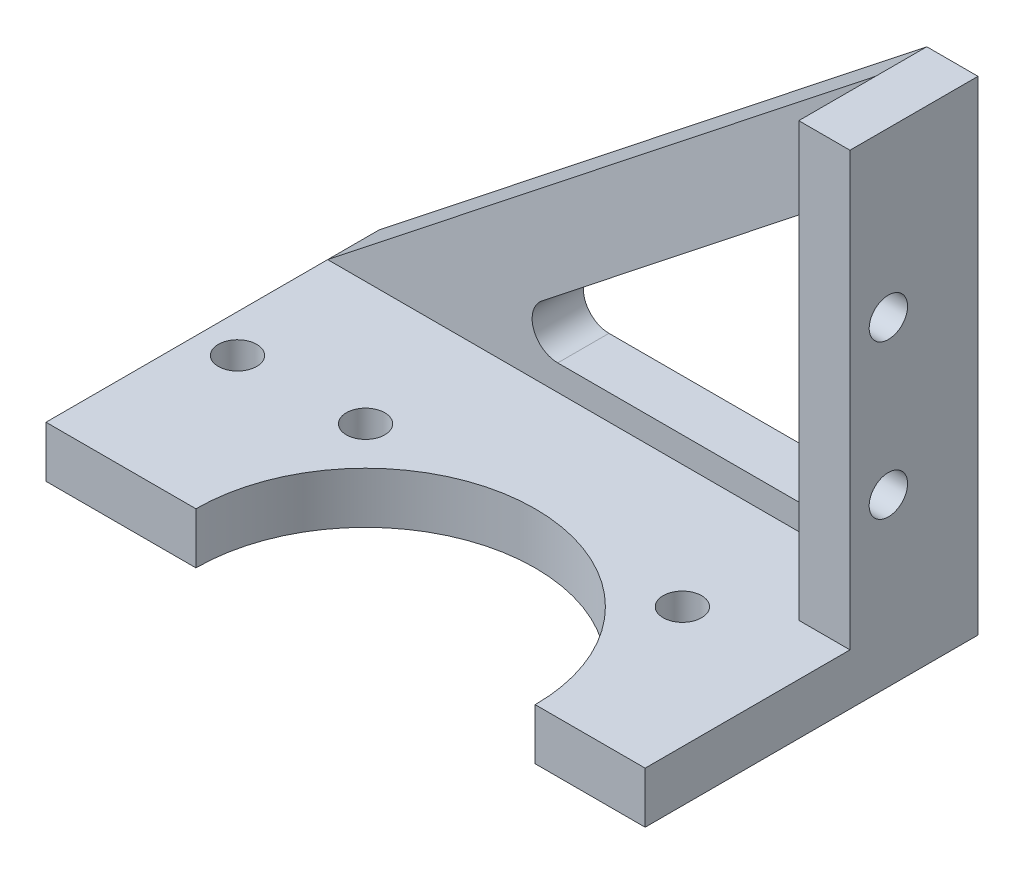
ISO-10303-21;
HEADER;
FILE_DESCRIPTION(('STEP AP214'),'2;1');
FILE_NAME('part.step','',(''),(''),'','','');
FILE_SCHEMA(('AUTOMOTIVE_DESIGN { 1 0 10303 214 1 1 1 1 }'));
ENDSEC;
DATA;
#1=APPLICATION_CONTEXT('core data for automotive mechanical design processes');
#2=APPLICATION_PROTOCOL_DEFINITION('international standard','automotive_design',2000,#1);
#3=PRODUCT_CONTEXT('',#1,'mechanical');
#4=PRODUCT('Part','Part','',(#3));
#5=PRODUCT_RELATED_PRODUCT_CATEGORY('part','',(#4));
#6=PRODUCT_DEFINITION_FORMATION('','',#4);
#7=PRODUCT_DEFINITION_CONTEXT('part definition',#1,'design');
#8=PRODUCT_DEFINITION('design','',#6,#7);
#9=PRODUCT_DEFINITION_SHAPE('','',#8);
#10=(LENGTH_UNIT() NAMED_UNIT(*) SI_UNIT(.MILLI.,.METRE.));
#11=(NAMED_UNIT(*) PLANE_ANGLE_UNIT() SI_UNIT($,.RADIAN.));
#12=(NAMED_UNIT(*) SI_UNIT($,.STERADIAN.) SOLID_ANGLE_UNIT());
#13=UNCERTAINTY_MEASURE_WITH_UNIT(LENGTH_MEASURE(1.E-05),#10,'distance_accuracy_value','');
#14=(GEOMETRIC_REPRESENTATION_CONTEXT(3) GLOBAL_UNCERTAINTY_ASSIGNED_CONTEXT((#13)) GLOBAL_UNIT_ASSIGNED_CONTEXT((#10,
#11,#12)) REPRESENTATION_CONTEXT('',''));
#15=CARTESIAN_POINT('',(0.,0.,0.));
#16=DIRECTION('',(0.,0.,1.));
#17=DIRECTION('',(1.,0.,0.));
#18=AXIS2_PLACEMENT_3D('',#15,#16,#17);
#19=CARTESIAN_POINT('',(0.,0.,0.));
#20=DIRECTION('',(0.,0.,1.));
#21=DIRECTION('',(-1.,0.,0.));
#22=AXIS2_PLACEMENT_3D('',#19,#20,#21);
#23=PLANE('',#22);
#24=DIRECTION('',(0.,1.,0.));
#25=VECTOR('',#24,1.);
#26=CARTESIAN_POINT('',(-11.69,-2.,0.));
#27=LINE('',#26,#25);
#28=CARTESIAN_POINT('',(-11.69,-2.,0.));
#29=VERTEX_POINT('',#28);
#30=CARTESIAN_POINT('',(-11.69,2.,0.));
#31=VERTEX_POINT('',#30);
#32=EDGE_CURVE('E203',#29,#31,#27,.T.);
#33=ORIENTED_EDGE('',*,*,#32,.T.);
#34=DIRECTION('',(-1.,0.,0.));
#35=VECTOR('',#34,1.);
#36=CARTESIAN_POINT('',(-16.4,2.,0.));
#37=LINE('',#36,#35);
#38=CARTESIAN_POINT('',(-23.4,2.,0.));
#39=VERTEX_POINT('',#38);
#40=EDGE_CURVE('E311',#31,#39,#37,.T.);
#41=ORIENTED_EDGE('',*,*,#40,.T.);
#42=DIRECTION('',(0.,-1.,0.));
#43=VECTOR('',#42,1.);
#44=CARTESIAN_POINT('',(-23.4,-2.,0.));
#45=LINE('',#44,#43);
#46=CARTESIAN_POINT('',(-23.4,-2.,0.));
#47=VERTEX_POINT('',#46);
#48=EDGE_CURVE('E295',#39,#47,#45,.T.);
#49=ORIENTED_EDGE('',*,*,#48,.T.);
#50=DIRECTION('',(1.,0.,0.));
#51=VECTOR('',#50,1.);
#52=CARTESIAN_POINT('',(23.4,-2.,0.));
#53=LINE('',#52,#51);
#54=EDGE_CURVE('E308',#47,#29,#53,.T.);
#55=ORIENTED_EDGE('',*,*,#54,.T.);
#56=EDGE_LOOP('',(#33,#41,#49,#55));
#57=FACE_BOUND('',#56,.T.);
#58=ADVANCED_FACE('F37',(#57),#23,.T.);
#59=CARTESIAN_POINT('',(19.4,35.8,-26.));
#60=DIRECTION('',(1.,0.,0.));
#61=DIRECTION('',(0.,1.,0.));
#62=AXIS2_PLACEMENT_3D('',#59,#60,#61);
#63=PLANE('',#62);
#64=CARTESIAN_POINT('',(19.4,23.,-19.));
#65=DIRECTION('',(1.,0.,0.));
#66=DIRECTION('',(0.,-1.,0.));
#67=AXIS2_PLACEMENT_3D('',#64,#65,#66);
#68=CIRCLE('',#67,1.5);
#69=CARTESIAN_POINT('',(19.4,21.5,-19.));
#70=VERTEX_POINT('',#69);
#71=EDGE_CURVE('E210',#70,#70,#68,.T.);
#72=ORIENTED_EDGE('',*,*,#71,.T.);
#73=EDGE_LOOP('',(#72));
#74=FACE_BOUND('',#73,.T.);
#75=CARTESIAN_POINT('',(19.4,11.,-19.));
#76=DIRECTION('',(1.,0.,0.));
#77=DIRECTION('',(0.,-1.,0.));
#78=AXIS2_PLACEMENT_3D('',#75,#76,#77);
#79=CIRCLE('',#78,1.5);
#80=CARTESIAN_POINT('',(19.4,9.50000000000001,-19.));
#81=VERTEX_POINT('',#80);
#82=EDGE_CURVE('E250',#81,#81,#79,.T.);
#83=ORIENTED_EDGE('',*,*,#82,.T.);
#84=EDGE_LOOP('',(#83));
#85=FACE_BOUND('',#84,.T.);
#86=DIRECTION('',(0.,0.,1.));
#87=VECTOR('',#86,1.);
#88=CARTESIAN_POINT('',(19.4,35.8,-26.));
#89=LINE('',#88,#87);
#90=CARTESIAN_POINT('',(19.4,35.8,-22.));
#91=VERTEX_POINT('',#90);
#92=CARTESIAN_POINT('',(19.4,35.8,-16.));
#93=VERTEX_POINT('',#92);
#94=EDGE_CURVE('E176',#91,#93,#89,.T.);
#95=ORIENTED_EDGE('',*,*,#94,.F.);
#96=DIRECTION('',(0.,1.,0.));
#97=VECTOR('',#96,1.);
#98=CARTESIAN_POINT('',(19.4,35.8,-22.));
#99=LINE('',#98,#97);
#100=CARTESIAN_POINT('',(19.4,2.,-22.));
#101=VERTEX_POINT('',#100);
#102=EDGE_CURVE('E175',#101,#91,#99,.T.);
#103=ORIENTED_EDGE('',*,*,#102,.F.);
#104=DIRECTION('',(0.,0.,1.));
#105=VECTOR('',#104,1.);
#106=CARTESIAN_POINT('',(19.4,2.,-26.));
#107=LINE('',#106,#105);
#108=CARTESIAN_POINT('',(19.4,2.,-16.));
#109=VERTEX_POINT('',#108);
#110=EDGE_CURVE('E157',#101,#109,#107,.T.);
#111=ORIENTED_EDGE('',*,*,#110,.T.);
#112=DIRECTION('',(0.,1.,0.));
#113=VECTOR('',#112,1.);
#114=CARTESIAN_POINT('',(19.4,35.8,-16.));
#115=LINE('',#114,#113);
#116=EDGE_CURVE('E164',#109,#93,#115,.T.);
#117=ORIENTED_EDGE('',*,*,#116,.T.);
#118=EDGE_LOOP('',(#95,#103,#111,#117));
#119=FACE_BOUND('',#118,.T.);
#120=ADVANCED_FACE('F173',(#74,#85,#119),#63,.F.);
#121=CARTESIAN_POINT('',(-16.4,2.,-26.));
#122=DIRECTION('',(0.,-1.,0.));
#123=DIRECTION('',(0.,0.,1.));
#124=AXIS2_PLACEMENT_3D('',#121,#122,#123);
#125=PLANE('',#124);
#126=CARTESIAN_POINT('',(-20.44,2.,-12.));
#127=DIRECTION('',(0.,-1.,0.));
#128=DIRECTION('',(-1.,0.,0.));
#129=AXIS2_PLACEMENT_3D('',#126,#127,#128);
#130=CIRCLE('',#129,1.5);
#131=CARTESIAN_POINT('',(-21.94,2.,-12.));
#132=VERTEX_POINT('',#131);
#133=EDGE_CURVE('E270',#132,#132,#130,.T.);
#134=ORIENTED_EDGE('',*,*,#133,.T.);
#135=EDGE_LOOP('',(#134));
#136=FACE_BOUND('',#135,.T.);
#137=CARTESIAN_POINT('',(13.9343686707647,2.,-12.3743686707644));
#138=DIRECTION('',(0.,-1.,0.));
#139=DIRECTION('',(-1.,0.,0.));
#140=AXIS2_PLACEMENT_3D('',#137,#138,#139);
#141=CIRCLE('',#140,1.5);
#142=CARTESIAN_POINT('',(12.4343686707647,2.,-12.3743686707644));
#143=VERTEX_POINT('',#142);
#144=EDGE_CURVE('E283',#143,#143,#141,.T.);
#145=ORIENTED_EDGE('',*,*,#144,.T.);
#146=EDGE_LOOP('',(#145));
#147=FACE_BOUND('',#146,.T.);
#148=CARTESIAN_POINT('',(-10.8143686707644,2.,-12.3743686707647));
#149=DIRECTION('',(0.,-1.,0.));
#150=DIRECTION('',(-1.,0.,0.));
#151=AXIS2_PLACEMENT_3D('',#148,#149,#150);
#152=CIRCLE('',#151,1.5);
#153=CARTESIAN_POINT('',(-12.3143686707644,2.,-12.3743686707647));
#154=VERTEX_POINT('',#153);
#155=EDGE_CURVE('E265',#154,#154,#152,.T.);
#156=ORIENTED_EDGE('',*,*,#155,.T.);
#157=EDGE_LOOP('',(#156));
#158=FACE_BOUND('',#157,.T.);
#159=CARTESIAN_POINT('',(23.4,2.00000000000001,0.));
#160=VERTEX_POINT('',#159);
#161=CARTESIAN_POINT('',(14.81,2.,0.));
#162=VERTEX_POINT('',#161);
#163=EDGE_CURVE('E185',#160,#162,#37,.T.);
#164=ORIENTED_EDGE('',*,*,#163,.F.);
#165=DIRECTION('',(0.,0.,-1.));
#166=VECTOR('',#165,1.);
#167=CARTESIAN_POINT('',(23.4,2.00000000000001,-26.));
#168=LINE('',#167,#166);
#169=CARTESIAN_POINT('',(23.4,2.,-16.));
#170=VERTEX_POINT('',#169);
#171=EDGE_CURVE('E160',#160,#170,#168,.T.);
#172=ORIENTED_EDGE('',*,*,#171,.T.);
#173=DIRECTION('',(-1.,0.,0.));
#174=VECTOR('',#173,1.);
#175=CARTESIAN_POINT('',(29.4,2.00000000000001,-16.));
#176=LINE('',#175,#174);
#177=EDGE_CURVE('E151',#170,#109,#176,.T.);
#178=ORIENTED_EDGE('',*,*,#177,.T.);
#179=ORIENTED_EDGE('',*,*,#110,.F.);
#180=DIRECTION('',(1.,0.,0.));
#181=VECTOR('',#180,1.);
#182=CARTESIAN_POINT('',(19.4,2.,-22.));
#183=LINE('',#182,#181);
#184=CARTESIAN_POINT('',(-23.4,2.,-22.));
#185=VERTEX_POINT('',#184);
#186=EDGE_CURVE('E290',#185,#101,#183,.T.);
#187=ORIENTED_EDGE('',*,*,#186,.F.);
#188=DIRECTION('',(0.,0.,1.));
#189=VECTOR('',#188,1.);
#190=CARTESIAN_POINT('',(-23.4,2.,-26.));
#191=LINE('',#190,#189);
#192=EDGE_CURVE('E197',#185,#39,#191,.T.);
#193=ORIENTED_EDGE('',*,*,#192,.T.);
#194=ORIENTED_EDGE('',*,*,#40,.F.);
#195=CARTESIAN_POINT('',(1.55999999999998,2.,0.));
#196=DIRECTION('',(0.,-1.,0.));
#197=DIRECTION('',(-1.,0.,0.));
#198=AXIS2_PLACEMENT_3D('',#195,#196,#197);
#199=CIRCLE('',#198,13.25);
#200=EDGE_CURVE('E277',#31,#162,#199,.T.);
#201=ORIENTED_EDGE('',*,*,#200,.T.);
#202=EDGE_LOOP('',(#164,#172,#178,#179,#187,#193,#194,#201));
#203=FACE_BOUND('',#202,.T.);
#204=ADVANCED_FACE('F154',(#136,#147,#158,#203),#125,.F.);
#205=CARTESIAN_POINT('',(-23.4,-2.,-26.));
#206=DIRECTION('',(1.,0.,0.));
#207=DIRECTION('',(0.,0.,1.));
#208=AXIS2_PLACEMENT_3D('',#205,#206,#207);
#209=PLANE('',#208);
#210=ORIENTED_EDGE('',*,*,#48,.F.);
#211=ORIENTED_EDGE('',*,*,#192,.F.);
#212=CARTESIAN_POINT('',(-23.4,2.,-26.));
#213=VERTEX_POINT('',#212);
#214=EDGE_CURVE('E198',#213,#185,#191,.T.);
#215=ORIENTED_EDGE('',*,*,#214,.F.);
#216=DIRECTION('',(0.,-1.,0.));
#217=VECTOR('',#216,1.);
#218=CARTESIAN_POINT('',(-23.4,-2.,-26.));
#219=LINE('',#218,#217);
#220=CARTESIAN_POINT('',(-23.4,-2.,-26.));
#221=VERTEX_POINT('',#220);
#222=EDGE_CURVE('E297',#213,#221,#219,.T.);
#223=ORIENTED_EDGE('',*,*,#222,.T.);
#224=DIRECTION('',(0.,0.,1.));
#225=VECTOR('',#224,1.);
#226=CARTESIAN_POINT('',(-23.4,-2.,-26.));
#227=LINE('',#226,#225);
#228=EDGE_CURVE('E195',#221,#47,#227,.T.);
#229=ORIENTED_EDGE('',*,*,#228,.T.);
#230=EDGE_LOOP('',(#210,#211,#215,#223,#229));
#231=FACE_BOUND('',#230,.T.);
#232=ADVANCED_FACE('F341',(#231),#209,.F.);
#233=CARTESIAN_POINT('',(23.4,-2.,-26.));
#234=DIRECTION('',(0.,1.,0.));
#235=DIRECTION('',(-1.,0.,0.));
#236=AXIS2_PLACEMENT_3D('',#233,#234,#235);
#237=PLANE('',#236);
#238=CARTESIAN_POINT('',(-20.44,-2.,-12.));
#239=DIRECTION('',(0.,-1.,0.));
#240=DIRECTION('',(-1.,0.,0.));
#241=AXIS2_PLACEMENT_3D('',#238,#239,#240);
#242=CIRCLE('',#241,1.5);
#243=CARTESIAN_POINT('',(-21.94,-2.,-12.));
#244=VERTEX_POINT('',#243);
#245=EDGE_CURVE('E266',#244,#244,#242,.T.);
#246=ORIENTED_EDGE('',*,*,#245,.F.);
#247=EDGE_LOOP('',(#246));
#248=FACE_BOUND('',#247,.T.);
#249=CARTESIAN_POINT('',(13.9343686707647,-2.,-12.3743686707644));
#250=DIRECTION('',(0.,-1.,0.));
#251=DIRECTION('',(-1.,0.,0.));
#252=AXIS2_PLACEMENT_3D('',#249,#250,#251);
#253=CIRCLE('',#252,1.5);
#254=CARTESIAN_POINT('',(12.4343686707647,-2.,-12.3743686707644));
#255=VERTEX_POINT('',#254);
#256=EDGE_CURVE('E273',#255,#255,#253,.T.);
#257=ORIENTED_EDGE('',*,*,#256,.F.);
#258=EDGE_LOOP('',(#257));
#259=FACE_BOUND('',#258,.T.);
#260=CARTESIAN_POINT('',(-10.8143686707644,-2.,-12.3743686707647));
#261=DIRECTION('',(0.,-1.,0.));
#262=DIRECTION('',(-1.,0.,0.));
#263=AXIS2_PLACEMENT_3D('',#260,#261,#262);
#264=CIRCLE('',#263,1.5);
#265=CARTESIAN_POINT('',(-12.3143686707644,-2.,-12.3743686707647));
#266=VERTEX_POINT('',#265);
#267=EDGE_CURVE('E274',#266,#266,#264,.T.);
#268=ORIENTED_EDGE('',*,*,#267,.F.);
#269=EDGE_LOOP('',(#268));
#270=FACE_BOUND('',#269,.T.);
#271=ORIENTED_EDGE('',*,*,#54,.F.);
#272=ORIENTED_EDGE('',*,*,#228,.F.);
#273=DIRECTION('',(1.,0.,0.));
#274=VECTOR('',#273,1.);
#275=CARTESIAN_POINT('',(23.4,-2.,-26.));
#276=LINE('',#275,#274);
#277=CARTESIAN_POINT('',(23.4,-2.,-26.));
#278=VERTEX_POINT('',#277);
#279=EDGE_CURVE('E300',#221,#278,#276,.T.);
#280=ORIENTED_EDGE('',*,*,#279,.T.);
#281=DIRECTION('',(0.,0.,1.));
#282=VECTOR('',#281,1.);
#283=CARTESIAN_POINT('',(23.4,-2.,-26.));
#284=LINE('',#283,#282);
#285=CARTESIAN_POINT('',(23.4,-2.,0.));
#286=VERTEX_POINT('',#285);
#287=EDGE_CURVE('E192',#278,#286,#284,.T.);
#288=ORIENTED_EDGE('',*,*,#287,.T.);
#289=CARTESIAN_POINT('',(14.81,-2.,0.));
#290=VERTEX_POINT('',#289);
#291=EDGE_CURVE('E307',#290,#286,#53,.T.);
#292=ORIENTED_EDGE('',*,*,#291,.F.);
#293=CARTESIAN_POINT('',(1.55999999999998,-2.,0.));
#294=DIRECTION('',(0.,-1.,0.));
#295=DIRECTION('',(-1.,0.,0.));
#296=AXIS2_PLACEMENT_3D('',#293,#294,#295);
#297=CIRCLE('',#296,13.25);
#298=EDGE_CURVE('E280',#29,#290,#297,.T.);
#299=ORIENTED_EDGE('',*,*,#298,.F.);
#300=EDGE_LOOP('',(#271,#272,#280,#288,#292,#299));
#301=FACE_BOUND('',#300,.T.);
#302=ADVANCED_FACE('F325',(#248,#259,#270,#301),#237,.F.);
#303=CARTESIAN_POINT('',(23.4,21.7284271247462,-26.));
#304=DIRECTION('',(-1.,0.,0.));
#305=DIRECTION('',(0.,0.,-1.));
#306=AXIS2_PLACEMENT_3D('',#303,#304,#305);
#307=PLANE('',#306);
#308=CARTESIAN_POINT('',(23.4,23.,-19.));
#309=DIRECTION('',(1.,0.,0.));
#310=DIRECTION('',(0.,0.,-1.));
#311=AXIS2_PLACEMENT_3D('',#308,#309,#310);
#312=CIRCLE('',#311,1.5);
#313=CARTESIAN_POINT('',(23.4,23.,-20.5));
#314=VERTEX_POINT('',#313);
#315=EDGE_CURVE('E171',#314,#314,#312,.T.);
#316=ORIENTED_EDGE('',*,*,#315,.F.);
#317=EDGE_LOOP('',(#316));
#318=FACE_BOUND('',#317,.T.);
#319=CARTESIAN_POINT('',(23.4,11.,-19.));
#320=DIRECTION('',(1.,0.,0.));
#321=DIRECTION('',(0.,0.,-1.));
#322=AXIS2_PLACEMENT_3D('',#319,#320,#321);
#323=CIRCLE('',#322,1.5);
#324=CARTESIAN_POINT('',(23.4,11.,-20.5));
#325=VERTEX_POINT('',#324);
#326=EDGE_CURVE('E207',#325,#325,#323,.T.);
#327=ORIENTED_EDGE('',*,*,#326,.F.);
#328=EDGE_LOOP('',(#327));
#329=FACE_BOUND('',#328,.T.);
#330=ORIENTED_EDGE('',*,*,#171,.F.);
#331=DIRECTION('',(0.,1.,0.));
#332=VECTOR('',#331,1.);
#333=CARTESIAN_POINT('',(23.4,21.7284271247462,0.));
#334=LINE('',#333,#332);
#335=EDGE_CURVE('E310',#286,#160,#334,.T.);
#336=ORIENTED_EDGE('',*,*,#335,.F.);
#337=ORIENTED_EDGE('',*,*,#287,.F.);
#338=DIRECTION('',(0.,1.,0.));
#339=VECTOR('',#338,1.);
#340=CARTESIAN_POINT('',(23.4,-2.,-26.));
#341=LINE('',#340,#339);
#342=CARTESIAN_POINT('',(23.4,35.8,-26.));
#343=VERTEX_POINT('',#342);
#344=EDGE_CURVE('E182',#278,#343,#341,.T.);
#345=ORIENTED_EDGE('',*,*,#344,.T.);
#346=DIRECTION('',(0.,0.,1.));
#347=VECTOR('',#346,1.);
#348=CARTESIAN_POINT('',(23.4,35.8,-26.));
#349=LINE('',#348,#347);
#350=CARTESIAN_POINT('',(23.4,35.8,-16.));
#351=VERTEX_POINT('',#350);
#352=EDGE_CURVE('E189',#343,#351,#349,.T.);
#353=ORIENTED_EDGE('',*,*,#352,.T.);
#354=DIRECTION('',(0.,1.,0.));
#355=VECTOR('',#354,1.);
#356=CARTESIAN_POINT('',(23.4,21.7284271247462,-16.));
#357=LINE('',#356,#355);
#358=EDGE_CURVE('E263',#170,#351,#357,.T.);
#359=ORIENTED_EDGE('',*,*,#358,.F.);
#360=EDGE_LOOP('',(#330,#336,#337,#345,#353,#359));
#361=FACE_BOUND('',#360,.T.);
#362=ADVANCED_FACE('F329',(#318,#329,#361),#307,.F.);
#363=CARTESIAN_POINT('',(23.4,35.8,-26.));
#364=DIRECTION('',(0.,-1.,0.));
#365=DIRECTION('',(1.,0.,0.));
#366=AXIS2_PLACEMENT_3D('',#363,#364,#365);
#367=PLANE('',#366);
#368=ORIENTED_EDGE('',*,*,#352,.F.);
#369=DIRECTION('',(-1.,0.,0.));
#370=VECTOR('',#369,1.);
#371=CARTESIAN_POINT('',(23.4,35.8,-26.));
#372=LINE('',#371,#370);
#373=CARTESIAN_POINT('',(19.4,35.8,-26.));
#374=VERTEX_POINT('',#373);
#375=EDGE_CURVE('E177',#343,#374,#372,.T.);
#376=ORIENTED_EDGE('',*,*,#375,.T.);
#377=EDGE_CURVE('E179',#374,#91,#89,.T.);
#378=ORIENTED_EDGE('',*,*,#377,.T.);
#379=ORIENTED_EDGE('',*,*,#94,.T.);
#380=DIRECTION('',(-1.,0.,0.));
#381=VECTOR('',#380,1.);
#382=CARTESIAN_POINT('',(29.4,35.8,-16.));
#383=LINE('',#382,#381);
#384=EDGE_CURVE('E163',#351,#93,#383,.T.);
#385=ORIENTED_EDGE('',*,*,#384,.F.);
#386=EDGE_LOOP('',(#368,#376,#378,#379,#385));
#387=FACE_BOUND('',#386,.T.);
#388=ADVANCED_FACE('F332',(#387),#367,.F.);
#389=CARTESIAN_POINT('',(0.,0.,-26.));
#390=DIRECTION('',(0.,0.,1.));
#391=DIRECTION('',(-1.,0.,0.));
#392=AXIS2_PLACEMENT_3D('',#389,#390,#391);
#393=PLANE('',#392);
#394=DIRECTION('',(1.,0.,0.));
#395=VECTOR('',#394,1.);
#396=CARTESIAN_POINT('',(17.4,4.,-26.));
#397=LINE('',#396,#395);
#398=CARTESIAN_POINT('',(-5.42675504269587,4.,-26.));
#399=VERTEX_POINT('',#398);
#400=CARTESIAN_POINT('',(15.4,4.,-26.));
#401=VERTEX_POINT('',#400);
#402=EDGE_CURVE('E251',#399,#401,#397,.T.);
#403=ORIENTED_EDGE('',*,*,#402,.T.);
#404=CARTESIAN_POINT('',(15.4,6.,-26.));
#405=DIRECTION('',(0.,0.,-1.));
#406=DIRECTION('',(-1.,0.,0.));
#407=AXIS2_PLACEMENT_3D('',#404,#405,#406);
#408=CIRCLE('',#407,2.);
#409=CARTESIAN_POINT('',(17.4,6.,-26.));
#410=VERTEX_POINT('',#409);
#411=EDGE_CURVE('E236',#410,#401,#408,.T.);
#412=ORIENTED_EDGE('',*,*,#411,.F.);
#413=DIRECTION('',(0.,1.,0.));
#414=VECTOR('',#413,1.);
#415=CARTESIAN_POINT('',(17.4,26.5751925311294,-26.));
#416=LINE('',#415,#414);
#417=CARTESIAN_POINT('',(17.4,22.447297206615,-26.));
#418=VERTEX_POINT('',#417);
#419=EDGE_CURVE('E246',#410,#418,#416,.T.);
#420=ORIENTED_EDGE('',*,*,#419,.T.);
#421=CARTESIAN_POINT('',(15.4,22.447297206615,-26.));
#422=DIRECTION('',(0.,0.,-1.));
#423=DIRECTION('',(-1.,0.,0.));
#424=AXIS2_PLACEMENT_3D('',#421,#422,#423);
#425=CIRCLE('',#424,2.);
#426=CARTESIAN_POINT('',(14.1604736298346,24.0168749771203,-26.));
#427=VERTEX_POINT('',#426);
#428=EDGE_CURVE('E45',#427,#418,#425,.T.);
#429=ORIENTED_EDGE('',*,*,#428,.F.);
#430=DIRECTION('',(-0.784788885252669,-0.619763185082716,0.));
#431=VECTOR('',#430,1.);
#432=CARTESIAN_POINT('',(-11.186338471371,3.99999999999999,-26.));
#433=LINE('',#432,#431);
#434=CARTESIAN_POINT('',(-6.6662814128613,7.56957777050533,-26.));
#435=VERTEX_POINT('',#434);
#436=EDGE_CURVE('E255',#427,#435,#433,.T.);
#437=ORIENTED_EDGE('',*,*,#436,.T.);
#438=CARTESIAN_POINT('',(-5.42675504269587,6.,-26.));
#439=DIRECTION('',(0.,0.,-1.));
#440=DIRECTION('',(-1.,0.,0.));
#441=AXIS2_PLACEMENT_3D('',#438,#439,#440);
#442=CIRCLE('',#441,2.);
#443=EDGE_CURVE('E230',#399,#435,#442,.T.);
#444=ORIENTED_EDGE('',*,*,#443,.F.);
#445=EDGE_LOOP('',(#403,#412,#420,#429,#437,#444));
#446=FACE_BOUND('',#445,.T.);
#447=DIRECTION('',(-0.784788885252669,-0.619763185082716,0.));
#448=VECTOR('',#447,1.);
#449=CARTESIAN_POINT('',(19.4,35.8,-26.));
#450=LINE('',#449,#448);
#451=EDGE_CURVE('E269',#374,#213,#450,.T.);
#452=ORIENTED_EDGE('',*,*,#451,.F.);
#453=ORIENTED_EDGE('',*,*,#375,.F.);
#454=ORIENTED_EDGE('',*,*,#344,.F.);
#455=ORIENTED_EDGE('',*,*,#279,.F.);
#456=ORIENTED_EDGE('',*,*,#222,.F.);
#457=EDGE_LOOP('',(#452,#453,#454,#455,#456));
#458=FACE_BOUND('',#457,.T.);
#459=ADVANCED_FACE('F248',(#446,#458),#393,.F.);
#460=ORIENTED_EDGE('',*,*,#163,.T.);
#461=DIRECTION('',(0.,1.,0.));
#462=VECTOR('',#461,1.);
#463=CARTESIAN_POINT('',(14.81,-2.,0.));
#464=LINE('',#463,#462);
#465=EDGE_CURVE('E201',#162,#290,#464,.F.);
#466=ORIENTED_EDGE('',*,*,#465,.T.);
#467=ORIENTED_EDGE('',*,*,#291,.T.);
#468=ORIENTED_EDGE('',*,*,#335,.T.);
#469=EDGE_LOOP('',(#460,#466,#467,#468));
#470=FACE_BOUND('',#469,.T.);
#471=ADVANCED_FACE('F318',(#470),#23,.T.);
#472=CARTESIAN_POINT('',(19.4,35.8,-22.));
#473=DIRECTION('',(-0.619763185082716,0.784788885252669,0.));
#474=DIRECTION('',(-0.784788885252669,-0.619763185082716,0.));
#475=AXIS2_PLACEMENT_3D('',#472,#473,#474);
#476=PLANE('',#475);
#477=ORIENTED_EDGE('',*,*,#451,.T.);
#478=ORIENTED_EDGE('',*,*,#214,.T.);
#479=DIRECTION('',(-0.784788885252669,-0.619763185082716,0.));
#480=VECTOR('',#479,1.);
#481=CARTESIAN_POINT('',(19.4,35.8,-22.));
#482=LINE('',#481,#480);
#483=EDGE_CURVE('E293',#91,#185,#482,.T.);
#484=ORIENTED_EDGE('',*,*,#483,.F.);
#485=ORIENTED_EDGE('',*,*,#377,.F.);
#486=EDGE_LOOP('',(#477,#478,#484,#485));
#487=FACE_BOUND('',#486,.T.);
#488=ADVANCED_FACE('F343',(#487),#476,.T.);
#489=CARTESIAN_POINT('',(0.,0.,-22.));
#490=DIRECTION('',(0.,0.,-1.));
#491=DIRECTION('',(1.,0.,0.));
#492=AXIS2_PLACEMENT_3D('',#489,#490,#491);
#493=PLANE('',#492);
#494=DIRECTION('',(1.,0.,0.));
#495=VECTOR('',#494,1.);
#496=CARTESIAN_POINT('',(0.,4.,-22.));
#497=LINE('',#496,#495);
#498=CARTESIAN_POINT('',(-5.42675504269587,4.,-22.));
#499=VERTEX_POINT('',#498);
#500=CARTESIAN_POINT('',(15.4,4.,-22.));
#501=VERTEX_POINT('',#500);
#502=EDGE_CURVE('E206',#499,#501,#497,.T.);
#503=ORIENTED_EDGE('',*,*,#502,.F.);
#504=CARTESIAN_POINT('',(-5.42675504269587,6.,-22.));
#505=DIRECTION('',(0.,0.,1.));
#506=DIRECTION('',(1.,0.,0.));
#507=AXIS2_PLACEMENT_3D('',#504,#505,#506);
#508=CIRCLE('',#507,2.);
#509=CARTESIAN_POINT('',(-6.6662814128613,7.56957777050533,-22.));
#510=VERTEX_POINT('',#509);
#511=EDGE_CURVE('E233',#510,#499,#508,.T.);
#512=ORIENTED_EDGE('',*,*,#511,.F.);
#513=DIRECTION('',(-0.784788885252669,-0.619763185082716,0.));
#514=VECTOR('',#513,1.);
#515=CARTESIAN_POINT('',(-6.24227729844974,7.90442214123222,-22.));
#516=LINE('',#515,#514);
#517=CARTESIAN_POINT('',(14.1604736298346,24.0168749771203,-22.));
#518=VERTEX_POINT('',#517);
#519=EDGE_CURVE('E217',#518,#510,#516,.T.);
#520=ORIENTED_EDGE('',*,*,#519,.F.);
#521=CARTESIAN_POINT('',(15.4,22.447297206615,-22.));
#522=DIRECTION('',(0.,0.,1.));
#523=DIRECTION('',(1.,0.,0.));
#524=AXIS2_PLACEMENT_3D('',#521,#522,#523);
#525=CIRCLE('',#524,2.);
#526=CARTESIAN_POINT('',(17.4,22.447297206615,-22.));
#527=VERTEX_POINT('',#526);
#528=EDGE_CURVE('E11',#527,#518,#525,.T.);
#529=ORIENTED_EDGE('',*,*,#528,.F.);
#530=DIRECTION('',(0.,1.,0.));
#531=VECTOR('',#530,1.);
#532=CARTESIAN_POINT('',(17.4,0.,-22.));
#533=LINE('',#532,#531);
#534=CARTESIAN_POINT('',(17.4,6.,-22.));
#535=VERTEX_POINT('',#534);
#536=EDGE_CURVE('E215',#535,#527,#533,.T.);
#537=ORIENTED_EDGE('',*,*,#536,.F.);
#538=CARTESIAN_POINT('',(15.4,6.,-22.));
#539=DIRECTION('',(0.,0.,1.));
#540=DIRECTION('',(1.,0.,0.));
#541=AXIS2_PLACEMENT_3D('',#538,#539,#540);
#542=CIRCLE('',#541,2.);
#543=EDGE_CURVE('E239',#501,#535,#542,.T.);
#544=ORIENTED_EDGE('',*,*,#543,.F.);
#545=EDGE_LOOP('',(#503,#512,#520,#529,#537,#544));
#546=FACE_BOUND('',#545,.T.);
#547=ORIENTED_EDGE('',*,*,#186,.T.);
#548=ORIENTED_EDGE('',*,*,#102,.T.);
#549=ORIENTED_EDGE('',*,*,#483,.T.);
#550=EDGE_LOOP('',(#547,#548,#549));
#551=FACE_BOUND('',#550,.T.);
#552=ADVANCED_FACE('F336',(#546,#551),#493,.F.);
#553=CARTESIAN_POINT('',(1.55999999999998,-2.,0.));
#554=DIRECTION('',(0.,1.,0.));
#555=DIRECTION('',(-1.,0.,0.));
#556=AXIS2_PLACEMENT_3D('',#553,#554,#555);
#557=CYLINDRICAL_SURFACE('',#556,13.25);
#558=ORIENTED_EDGE('',*,*,#32,.F.);
#559=ORIENTED_EDGE('',*,*,#298,.T.);
#560=ORIENTED_EDGE('',*,*,#465,.F.);
#561=ORIENTED_EDGE('',*,*,#200,.F.);
#562=EDGE_LOOP('',(#558,#559,#560,#561));
#563=FACE_BOUND('',#562,.T.);
#564=ADVANCED_FACE('F321',(#563),#557,.F.);
#565=CARTESIAN_POINT('',(-10.8143686707644,-2.,-12.3743686707647));
#566=DIRECTION('',(0.,1.,0.));
#567=DIRECTION('',(-1.,0.,0.));
#568=AXIS2_PLACEMENT_3D('',#565,#566,#567);
#569=CYLINDRICAL_SURFACE('',#568,1.5);
#570=ORIENTED_EDGE('',*,*,#267,.T.);
#571=EDGE_LOOP('',(#570));
#572=FACE_BOUND('',#571,.T.);
#573=ORIENTED_EDGE('',*,*,#155,.F.);
#574=EDGE_LOOP('',(#573));
#575=FACE_BOUND('',#574,.T.);
#576=ADVANCED_FACE('F417',(#572,#575),#569,.F.);
#577=CARTESIAN_POINT('',(13.9343686707647,-2.,-12.3743686707644));
#578=DIRECTION('',(0.,1.,0.));
#579=DIRECTION('',(-1.,0.,0.));
#580=AXIS2_PLACEMENT_3D('',#577,#578,#579);
#581=CYLINDRICAL_SURFACE('',#580,1.5);
#582=ORIENTED_EDGE('',*,*,#256,.T.);
#583=EDGE_LOOP('',(#582));
#584=FACE_BOUND('',#583,.T.);
#585=ORIENTED_EDGE('',*,*,#144,.F.);
#586=EDGE_LOOP('',(#585));
#587=FACE_BOUND('',#586,.T.);
#588=ADVANCED_FACE('F415',(#584,#587),#581,.F.);
#589=CARTESIAN_POINT('',(-20.44,-2.,-12.));
#590=DIRECTION('',(0.,1.,0.));
#591=DIRECTION('',(-1.,0.,0.));
#592=AXIS2_PLACEMENT_3D('',#589,#590,#591);
#593=CYLINDRICAL_SURFACE('',#592,1.5);
#594=ORIENTED_EDGE('',*,*,#245,.T.);
#595=EDGE_LOOP('',(#594));
#596=FACE_BOUND('',#595,.T.);
#597=ORIENTED_EDGE('',*,*,#133,.F.);
#598=EDGE_LOOP('',(#597));
#599=FACE_BOUND('',#598,.T.);
#600=ADVANCED_FACE('F412',(#596,#599),#593,.F.);
#601=CARTESIAN_POINT('',(29.4,35.8,-16.));
#602=DIRECTION('',(0.,0.,-1.));
#603=DIRECTION('',(0.,-1.,0.));
#604=AXIS2_PLACEMENT_3D('',#601,#602,#603);
#605=PLANE('',#604);
#606=ORIENTED_EDGE('',*,*,#177,.F.);
#607=ORIENTED_EDGE('',*,*,#358,.T.);
#608=ORIENTED_EDGE('',*,*,#384,.T.);
#609=ORIENTED_EDGE('',*,*,#116,.F.);
#610=EDGE_LOOP('',(#606,#607,#608,#609));
#611=FACE_BOUND('',#610,.T.);
#612=ADVANCED_FACE('F167',(#611),#605,.F.);
#613=CARTESIAN_POINT('',(29.4,11.,-19.));
#614=DIRECTION('',(-1.,0.,0.));
#615=DIRECTION('',(0.,-1.,0.));
#616=AXIS2_PLACEMENT_3D('',#613,#614,#615);
#617=CYLINDRICAL_SURFACE('',#616,1.5);
#618=ORIENTED_EDGE('',*,*,#82,.F.);
#619=EDGE_LOOP('',(#618));
#620=FACE_BOUND('',#619,.T.);
#621=ORIENTED_EDGE('',*,*,#326,.T.);
#622=EDGE_LOOP('',(#621));
#623=FACE_BOUND('',#622,.T.);
#624=ADVANCED_FACE('F405',(#620,#623),#617,.F.);
#625=CARTESIAN_POINT('',(29.4,23.,-19.));
#626=DIRECTION('',(-1.,0.,0.));
#627=DIRECTION('',(0.,-1.,0.));
#628=AXIS2_PLACEMENT_3D('',#625,#626,#627);
#629=CYLINDRICAL_SURFACE('',#628,1.5);
#630=ORIENTED_EDGE('',*,*,#71,.F.);
#631=EDGE_LOOP('',(#630));
#632=FACE_BOUND('',#631,.T.);
#633=ORIENTED_EDGE('',*,*,#315,.T.);
#634=EDGE_LOOP('',(#633));
#635=FACE_BOUND('',#634,.T.);
#636=ADVANCED_FACE('F399',(#632,#635),#629,.F.);
#637=CARTESIAN_POINT('',(-11.186338471371,3.99999999999999,-16.));
#638=DIRECTION('',(-0.619763185082716,0.784788885252669,0.));
#639=DIRECTION('',(-0.784788885252669,-0.619763185082716,0.));
#640=AXIS2_PLACEMENT_3D('',#637,#638,#639);
#641=PLANE('',#640);
#642=ORIENTED_EDGE('',*,*,#436,.F.);
#643=DIRECTION('',(0.,0.,-1.));
#644=VECTOR('',#643,1.);
#645=CARTESIAN_POINT('',(14.1604736298346,24.0168749771203,-26.));
#646=LINE('',#645,#644);
#647=EDGE_CURVE('E224',#518,#427,#646,.T.);
#648=ORIENTED_EDGE('',*,*,#647,.F.);
#649=ORIENTED_EDGE('',*,*,#519,.T.);
#650=DIRECTION('',(0.,0.,-1.));
#651=VECTOR('',#650,1.);
#652=CARTESIAN_POINT('',(-6.6662814128613,7.56957777050533,-22.));
#653=LINE('',#652,#651);
#654=EDGE_CURVE('E226',#435,#510,#653,.F.);
#655=ORIENTED_EDGE('',*,*,#654,.F.);
#656=EDGE_LOOP('',(#642,#648,#649,#655));
#657=FACE_BOUND('',#656,.T.);
#658=ADVANCED_FACE('F391',(#657),#641,.F.);
#659=CARTESIAN_POINT('',(17.4,26.5751925311294,-16.));
#660=DIRECTION('',(1.,0.,0.));
#661=DIRECTION('',(0.,1.,0.));
#662=AXIS2_PLACEMENT_3D('',#659,#660,#661);
#663=PLANE('',#662);
#664=ORIENTED_EDGE('',*,*,#536,.T.);
#665=DIRECTION('',(0.,0.,-1.));
#666=VECTOR('',#665,1.);
#667=CARTESIAN_POINT('',(17.4,22.447297206615,-22.));
#668=LINE('',#667,#666);
#669=EDGE_CURVE('E51',#418,#527,#668,.F.);
#670=ORIENTED_EDGE('',*,*,#669,.F.);
#671=ORIENTED_EDGE('',*,*,#419,.F.);
#672=DIRECTION('',(0.,0.,-1.));
#673=VECTOR('',#672,1.);
#674=CARTESIAN_POINT('',(17.4,6.,-26.));
#675=LINE('',#674,#673);
#676=EDGE_CURVE('E58',#535,#410,#675,.T.);
#677=ORIENTED_EDGE('',*,*,#676,.F.);
#678=EDGE_LOOP('',(#664,#670,#671,#677));
#679=FACE_BOUND('',#678,.T.);
#680=ADVANCED_FACE('F389',(#679),#663,.F.);
#681=CARTESIAN_POINT('',(17.4,4.,-16.));
#682=DIRECTION('',(0.,-1.,0.));
#683=DIRECTION('',(1.,0.,0.));
#684=AXIS2_PLACEMENT_3D('',#681,#682,#683);
#685=PLANE('',#684);
#686=ORIENTED_EDGE('',*,*,#502,.T.);
#687=DIRECTION('',(0.,0.,-1.));
#688=VECTOR('',#687,1.);
#689=CARTESIAN_POINT('',(15.4,4.,-22.));
#690=LINE('',#689,#688);
#691=EDGE_CURVE('E220',#401,#501,#690,.F.);
#692=ORIENTED_EDGE('',*,*,#691,.F.);
#693=ORIENTED_EDGE('',*,*,#402,.F.);
#694=DIRECTION('',(0.,0.,-1.));
#695=VECTOR('',#694,1.);
#696=CARTESIAN_POINT('',(-5.42675504269587,4.,-26.));
#697=LINE('',#696,#695);
#698=EDGE_CURVE('E222',#499,#399,#697,.T.);
#699=ORIENTED_EDGE('',*,*,#698,.F.);
#700=EDGE_LOOP('',(#686,#692,#693,#699));
#701=FACE_BOUND('',#700,.T.);
#702=ADVANCED_FACE('F377',(#701),#685,.F.);
#703=CARTESIAN_POINT('',(-5.42675504269587,6.,-16.));
#704=DIRECTION('',(0.,0.,1.));
#705=DIRECTION('',(-1.,0.,0.));
#706=AXIS2_PLACEMENT_3D('',#703,#704,#705);
#707=CYLINDRICAL_SURFACE('',#706,2.);
#708=ORIENTED_EDGE('',*,*,#511,.T.);
#709=ORIENTED_EDGE('',*,*,#698,.T.);
#710=ORIENTED_EDGE('',*,*,#443,.T.);
#711=ORIENTED_EDGE('',*,*,#654,.T.);
#712=EDGE_LOOP('',(#708,#709,#710,#711));
#713=FACE_BOUND('',#712,.T.);
#714=ADVANCED_FACE('F374',(#713),#707,.F.);
#715=CARTESIAN_POINT('',(15.4,6.,-16.));
#716=DIRECTION('',(0.,0.,1.));
#717=DIRECTION('',(-1.,0.,0.));
#718=AXIS2_PLACEMENT_3D('',#715,#716,#717);
#719=CYLINDRICAL_SURFACE('',#718,2.);
#720=ORIENTED_EDGE('',*,*,#543,.T.);
#721=ORIENTED_EDGE('',*,*,#676,.T.);
#722=ORIENTED_EDGE('',*,*,#411,.T.);
#723=ORIENTED_EDGE('',*,*,#691,.T.);
#724=EDGE_LOOP('',(#720,#721,#722,#723));
#725=FACE_BOUND('',#724,.T.);
#726=ADVANCED_FACE('F376',(#725),#719,.F.);
#727=CARTESIAN_POINT('',(15.4,22.447297206615,-16.));
#728=DIRECTION('',(0.,0.,1.));
#729=DIRECTION('',(-1.,0.,0.));
#730=AXIS2_PLACEMENT_3D('',#727,#728,#729);
#731=CYLINDRICAL_SURFACE('',#730,2.);
#732=ORIENTED_EDGE('',*,*,#528,.T.);
#733=ORIENTED_EDGE('',*,*,#647,.T.);
#734=ORIENTED_EDGE('',*,*,#428,.T.);
#735=ORIENTED_EDGE('',*,*,#669,.T.);
#736=EDGE_LOOP('',(#732,#733,#734,#735));
#737=FACE_BOUND('',#736,.T.);
#738=ADVANCED_FACE('F39',(#737),#731,.F.);
#739=CLOSED_SHELL('',(#58,#120,#204,#232,#302,#362,#388,#459,#471,#488,#552,#564,#576,#588,#600,
#612,#624,#636,#658,#680,#702,#714,#726,#738));
#740=MANIFOLD_SOLID_BREP('B2',#739);
#741=ADVANCED_BREP_SHAPE_REPRESENTATION('',(#18,#740),#14);
#742=SHAPE_DEFINITION_REPRESENTATION(#9,#741);
ENDSEC;
END-ISO-10303-21;
